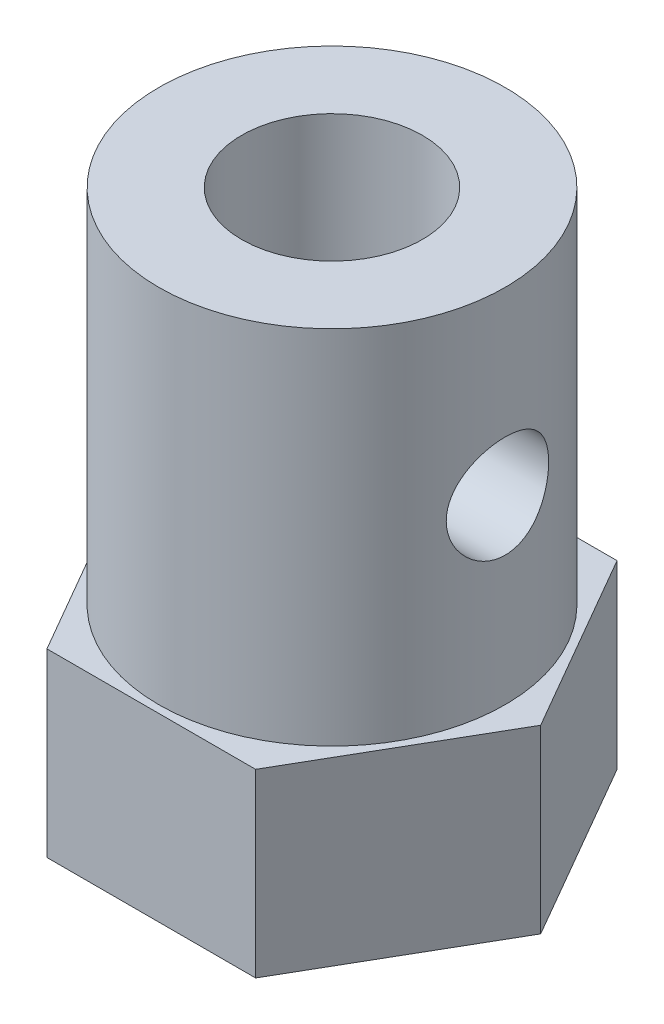
ISO-10303-21;
HEADER;
FILE_DESCRIPTION(('STEP AP214'),'2;1');
FILE_NAME('part.step','',(''),(''),'','','');
FILE_SCHEMA(('AUTOMOTIVE_DESIGN { 1 0 10303 214 1 1 1 1 }'));
ENDSEC;
DATA;
#1=APPLICATION_CONTEXT('core data for automotive mechanical design processes');
#2=APPLICATION_PROTOCOL_DEFINITION('international standard','automotive_design',2000,#1);
#3=PRODUCT_CONTEXT('',#1,'mechanical');
#4=PRODUCT('Part','Part','',(#3));
#5=PRODUCT_RELATED_PRODUCT_CATEGORY('part','',(#4));
#6=PRODUCT_DEFINITION_FORMATION('','',#4);
#7=PRODUCT_DEFINITION_CONTEXT('part definition',#1,'design');
#8=PRODUCT_DEFINITION('design','',#6,#7);
#9=PRODUCT_DEFINITION_SHAPE('','',#8);
#10=(LENGTH_UNIT() NAMED_UNIT(*) SI_UNIT(.MILLI.,.METRE.));
#11=(NAMED_UNIT(*) PLANE_ANGLE_UNIT() SI_UNIT($,.RADIAN.));
#12=(NAMED_UNIT(*) SI_UNIT($,.STERADIAN.) SOLID_ANGLE_UNIT());
#13=UNCERTAINTY_MEASURE_WITH_UNIT(LENGTH_MEASURE(1.E-05),#10,'distance_accuracy_value','');
#14=(GEOMETRIC_REPRESENTATION_CONTEXT(3) GLOBAL_UNCERTAINTY_ASSIGNED_CONTEXT((#13)) GLOBAL_UNIT_ASSIGNED_CONTEXT((#10,
#11,#12)) REPRESENTATION_CONTEXT('',''));
#15=CARTESIAN_POINT('',(0.,0.,0.));
#16=DIRECTION('',(0.,0.,1.));
#17=DIRECTION('',(1.,0.,0.));
#18=AXIS2_PLACEMENT_3D('',#15,#16,#17);
#19=CARTESIAN_POINT('',(0.,17.9,0.));
#20=DIRECTION('',(0.,1.,0.));
#21=DIRECTION('',(0.,0.,1.));
#22=AXIS2_PLACEMENT_3D('',#19,#20,#21);
#23=CYLINDRICAL_SURFACE('',#22,3.);
#24=CARTESIAN_POINT('',(0.,30.,0.));
#25=DIRECTION('',(0.,1.,0.));
#26=DIRECTION('',(0.,0.,1.));
#27=AXIS2_PLACEMENT_3D('',#24,#25,#26);
#28=CIRCLE('',#27,3.);
#29=CARTESIAN_POINT('',(0.,30.,3.));
#30=VERTEX_POINT('',#29);
#31=EDGE_CURVE('E29',#30,#30,#28,.T.);
#32=ORIENTED_EDGE('',*,*,#31,.T.);
#33=EDGE_LOOP('',(#32));
#34=FACE_BOUND('',#33,.T.);
#35=CARTESIAN_POINT('',(2.471841418862,24.,1.7));
#36=CARTESIAN_POINT('',(2.471841418862,23.919608490654,1.7));
#37=CARTESIAN_POINT('',(2.474978398703,23.839267003671,1.695437922941));
#38=CARTESIAN_POINT('',(2.48124747347,23.759261129618,1.686324882331));
#39=CARTESIAN_POINT('',(2.490532243024,23.679891720581,1.672686978551));
#40=CARTESIAN_POINT('',(2.502615676114,23.601474893208,1.65457926602));
#41=CARTESIAN_POINT('',(2.531804023818,23.447009603252,1.60956201305));
#42=CARTESIAN_POINT('',(2.548922440651,23.370967114066,1.582629838758));
#43=CARTESIAN_POINT('',(2.568270797173,23.296382331673,1.551353666844));
#44=CARTESIAN_POINT('',(2.589526398713,23.223448685663,1.51576549763));
#45=CARTESIAN_POINT('',(2.612330276443,23.152387090927,1.475890452406));
#46=CARTESIAN_POINT('',(2.658645811048,23.01916875947,1.390609610484));
#47=CARTESIAN_POINT('',(2.682014228997,22.956709215658,1.345743805274));
#48=CARTESIAN_POINT('',(2.706118165348,22.896204258501,1.297132788015));
#49=CARTESIAN_POINT('',(2.730655303134,22.837834024376,1.244733956587));
#50=CARTESIAN_POINT('',(2.755303342166,22.781825582429,1.188493502947));
#51=CARTESIAN_POINT('',(2.803329771086,22.676835299568,1.070179215338));
#52=CARTESIAN_POINT('',(2.826738539309,22.627649804761,1.008319529317));
#53=CARTESIAN_POINT('',(2.84961345263,22.581192933275,0.94274661728));
#54=CARTESIAN_POINT('',(2.8715985497,22.537801639549,0.873455511936));
#55=CARTESIAN_POINT('',(2.892316025067,22.49785834377,0.800465404399));
#56=CARTESIAN_POINT('',(2.937844330259,22.411686685689,0.617341309515));
#57=CARTESIAN_POINT('',(2.961301105501,22.368702167627,0.503034186623));
#58=CARTESIAN_POINT('',(2.98021552474,22.334914783939,0.382350255227));
#59=CARTESIAN_POINT('',(2.99335179765,22.311731859621,0.257015556875));
#60=CARTESIAN_POINT('',(3.,22.3,0.128918977196));
#61=CARTESIAN_POINT('',(3.,22.3,-0.12892695359));
#62=CARTESIAN_POINT('',(2.993350970784,22.311733309937,-0.257020625034));
#63=CARTESIAN_POINT('',(2.980215179585,22.334915413848,-0.382347078495));
#64=CARTESIAN_POINT('',(2.961302690449,22.368699455888,-0.503023484269));
#65=CARTESIAN_POINT('',(2.937847171272,22.411681308487,-0.617329882381));
#66=CARTESIAN_POINT('',(2.892563465242,22.497390012474,-0.799470149734));
#67=CARTESIAN_POINT('',(2.872135984252,22.536765576972,-0.871560642146));
#68=CARTESIAN_POINT('',(2.85046833533,22.579506115633,-0.940048484606));
#69=CARTESIAN_POINT('',(2.82792434797,22.62524278634,-1.004913890203));
#70=CARTESIAN_POINT('',(2.804847259377,22.673649604885,-1.06616030497));
#71=CARTESIAN_POINT('',(2.756846405376,22.778322929075,-1.184967834719));
#72=CARTESIAN_POINT('',(2.731879022408,22.834924967148,-1.24211936294));
#73=CARTESIAN_POINT('',(2.70701305341,22.893957936589,-1.295328599526));
#74=CARTESIAN_POINT('',(2.682583783114,22.95518473303,-1.344651745628));
#75=CARTESIAN_POINT('',(2.658905373722,23.018417836752,-1.390133353198));
#76=CARTESIAN_POINT('',(2.612192484001,23.152788046097,-1.476142384813));
#77=CARTESIAN_POINT('',(2.589286177906,23.224201898225,-1.516184442826));
#78=CARTESIAN_POINT('',(2.567945061972,23.297504665992,-1.5518983557));
#79=CARTESIAN_POINT('',(2.548533286834,23.37247202526,-1.583258452396));
#80=CARTESIAN_POINT('',(2.531377894732,23.448907625947,-1.610232149477));
#81=CARTESIAN_POINT('',(2.502316464185,23.603421663627,-1.655027596624));
#82=CARTESIAN_POINT('',(2.49034834024,23.681467662664,-1.672957070266));
#83=CARTESIAN_POINT('',(2.481154310846,23.760452679925,-1.686460302154));
#84=CARTESIAN_POINT('',(2.474947296744,23.840065074492,-1.695483168499));
#85=CARTESIAN_POINT('',(2.471841418862,23.920008118195,-1.7));
#86=CARTESIAN_POINT('',(2.471841418862,24.080391509346,-1.7));
#87=CARTESIAN_POINT('',(2.474978398703,24.160732996329,-1.695437922941));
#88=CARTESIAN_POINT('',(2.48124747347,24.240738870382,-1.686324882331));
#89=CARTESIAN_POINT('',(2.490532243024,24.320108279419,-1.672686978551));
#90=CARTESIAN_POINT('',(2.502615676114,24.398525106792,-1.65457926602));
#91=CARTESIAN_POINT('',(2.531804023818,24.552990396748,-1.60956201305));
#92=CARTESIAN_POINT('',(2.548922440651,24.629032885934,-1.582629838758));
#93=CARTESIAN_POINT('',(2.568270797173,24.703617668327,-1.551353666844));
#94=CARTESIAN_POINT('',(2.589526398713,24.776551314337,-1.51576549763));
#95=CARTESIAN_POINT('',(2.612330276443,24.847612909073,-1.475890452406));
#96=CARTESIAN_POINT('',(2.667307520997,25.005745096256,-1.374660794968));
#97=CARTESIAN_POINT('',(2.700281320251,25.091431773809,-1.310407545529));
#98=CARTESIAN_POINT('',(2.734454658158,25.173246646149,-1.23893223428));
#99=CARTESIAN_POINT('',(2.769011213869,25.25068233369,-1.160084840717));
#100=CARTESIAN_POINT('',(2.80304886165,25.323036475565,-1.073694796416));
#101=CARTESIAN_POINT('',(2.860601527271,25.440495855795,-0.907108931722));
#102=CARTESIAN_POINT('',(2.884788884891,25.488143402192,-0.829886817859));
#103=CARTESIAN_POINT('',(2.907559097725,25.53169037906,-0.748088929428));
#104=CARTESIAN_POINT('',(2.928347333545,25.570528821907,-0.66189671824));
#105=CARTESIAN_POINT('',(2.946595411065,25.604042820821,-0.571555310325));
#106=CARTESIAN_POINT('',(2.973920890438,25.653645684876,-0.402020675508));
#107=CARTESIAN_POINT('',(2.984099637851,25.671873011743,-0.324225252002));
#108=CARTESIAN_POINT('',(2.991978929912,25.685846397278,-0.2445377297));
#109=CARTESIAN_POINT('',(2.997322290154,25.695273940768,-0.163537002262));
#110=CARTESIAN_POINT('',(3.,25.7,-0.08182201491294));
#111=CARTESIAN_POINT('',(3.,25.7,0.12892695359));
#112=CARTESIAN_POINT('',(2.993350970784,25.688266690063,0.257020625035));
#113=CARTESIAN_POINT('',(2.980215179585,25.665084586152,0.382347078494));
#114=CARTESIAN_POINT('',(2.961302690449,25.631300544112,0.503023484269));
#115=CARTESIAN_POINT('',(2.937847171272,25.588318691513,0.61732988238));
#116=CARTESIAN_POINT('',(2.892563465238,25.502609987517,0.799470149752));
#117=CARTESIAN_POINT('',(2.872135984252,25.463234423029,0.87156064214));
#118=CARTESIAN_POINT('',(2.850468335335,25.420493884377,0.94004848459));
#119=CARTESIAN_POINT('',(2.827924347971,25.374757213664,1.004913890201));
#120=CARTESIAN_POINT('',(2.804847259371,25.326350395102,1.066160304984));
#121=CARTESIAN_POINT('',(2.756846405376,25.221677070925,1.184967834719));
#122=CARTESIAN_POINT('',(2.731879022408,25.165075032852,1.24211936294));
#123=CARTESIAN_POINT('',(2.70701305341,25.106042063411,1.295328599526));
#124=CARTESIAN_POINT('',(2.682583783114,25.04481526697,1.344651745628));
#125=CARTESIAN_POINT('',(2.658905373722,24.981582163248,1.390133353198));
#126=CARTESIAN_POINT('',(2.612192484001,24.847211953903,1.476142384813));
#127=CARTESIAN_POINT('',(2.589286177906,24.775798101775,1.516184442826));
#128=CARTESIAN_POINT('',(2.567945061972,24.702495334008,1.5518983557));
#129=CARTESIAN_POINT('',(2.548533286834,24.62752797474,1.583258452396));
#130=CARTESIAN_POINT('',(2.531377894732,24.551092374053,1.610232149477));
#131=CARTESIAN_POINT('',(2.502316464185,24.396578336373,1.655027596624));
#132=CARTESIAN_POINT('',(2.49034834024,24.318532337336,1.672957070266));
#133=CARTESIAN_POINT('',(2.481154310846,24.239547320075,1.686460302154));
#134=CARTESIAN_POINT('',(2.474947296744,24.159934925508,1.695483168499));
#135=CARTESIAN_POINT('',(2.471841418862,24.079991881805,1.7));
#136=CARTESIAN_POINT('',(2.471841418862,24.,1.7));
#137=B_SPLINE_CURVE_WITH_KNOTS('',6,(#35,#36,#37,#38,#39,#40,#41,#42,#43,#44,#45,#46,#47,#48,
#49,#50,#51,#52,#53,#54,#55,#56,#57,#58,#59,#60,#61,#62,#63,#64,#65,#66,#67,#68,#69,#70,#71,#72,
#73,#74,#75,#76,#77,#78,#79,#80,#81,#82,#83,#84,#85,#86,#87,#88,#89,#90,#91,#92,#93,#94,#95,#96,
#97,#98,#99,#100,#101,#102,#103,#104,#105,#106,#107,#108,#109,#110,#111,#112,#113,#114,#115,
#116,#117,#118,#119,#120,#121,#122,#123,#124,#125,#126,#127,#128,#129,#130,#131,#132,#133,#134,
#135,#136),.UNSPECIFIED.,.T.,.F.,(7,5,5,5,5,5,5,5,5,5,5,5,5,5,5,5,5,5,5,5,7),(0.,
0.04899157983823,0.09810991635111,0.143907845712,0.188203069379,0.249746289263,0.311293316911,
0.35501133644,0.40139027906,0.450741024641,0.499486628116,0.548475757374,0.597591636966,
0.661137174051,0.710133708572,0.749337978766,0.811112149558,0.854991513176,0.9015416202,
0.95107449781,1.),.UNSPECIFIED.);
#138=CARTESIAN_POINT('',(2.471841418862,24.,1.7));
#139=VERTEX_POINT('',#138);
#140=EDGE_CURVE('E11',#139,#139,#137,.T.);
#141=ORIENTED_EDGE('',*,*,#140,.T.);
#142=EDGE_LOOP('',(#141));
#143=FACE_BOUND('',#142,.T.);
#144=CARTESIAN_POINT('',(0.,17.9,0.));
#145=DIRECTION('',(0.,1.,0.));
#146=DIRECTION('',(0.,0.,1.));
#147=AXIS2_PLACEMENT_3D('',#144,#145,#146);
#148=CIRCLE('',#147,3.);
#149=CARTESIAN_POINT('',(0.,17.9,3.));
#150=VERTEX_POINT('',#149);
#151=EDGE_CURVE('E123',#150,#150,#148,.T.);
#152=ORIENTED_EDGE('',*,*,#151,.F.);
#153=EDGE_LOOP('',(#152));
#154=FACE_BOUND('',#153,.T.);
#155=ADVANCED_FACE('F17',(#34,#143,#154),#23,.F.);
#156=CARTESIAN_POINT('',(0.,24.,0.));
#157=DIRECTION('',(1.,0.,0.));
#158=DIRECTION('',(0.,0.,1.));
#159=AXIS2_PLACEMENT_3D('',#156,#157,#158);
#160=CYLINDRICAL_SURFACE('',#159,1.7);
#161=CARTESIAN_POINT('',(5.49295002708,24.,1.7));
#162=CARTESIAN_POINT('',(5.49295002708,23.820677389687,1.7));
#163=CARTESIAN_POINT('',(5.49964018513,23.641698034388,1.678382827136));
#164=CARTESIAN_POINT('',(5.512977509474,23.464769240056,1.635289055267));
#165=CARTESIAN_POINT('',(5.532510325225,23.291721164574,1.570487487231));
#166=CARTESIAN_POINT('',(5.557359670086,23.12468729057,1.483502577131));
#167=CARTESIAN_POINT('',(5.586135625624,22.966295695157,1.373717082144));
#168=CARTESIAN_POINT('',(5.616860356463,22.819931075266,1.240526366785));
#169=CARTESIAN_POINT('',(5.673280088304,22.576700906581,0.94651159949));
#170=CARTESIAN_POINT('',(5.700139235383,22.471527868633,0.785984896545));
#171=CARTESIAN_POINT('',(5.724776668052,22.383666740285,0.604584574656));
#172=CARTESIAN_POINT('',(5.743968804482,22.319666048249,0.40681394261));
#173=CARTESIAN_POINT('',(5.754983435051,22.283747098328,0.198592335073));
#174=CARTESIAN_POINT('',(5.756589689183,22.277940078683,-0.01349457266515));
#175=CARTESIAN_POINT('',(5.749187308175,22.302037663257,-0.222696117771));
#176=CARTESIAN_POINT('',(5.719371879034,22.405873193373,-0.627108806778));
#177=CARTESIAN_POINT('',(5.697144567532,22.485032481845,-0.815107620397));
#178=CARTESIAN_POINT('',(5.670164282104,22.585652726599,-0.984694595245));
#179=CARTESIAN_POINT('',(5.640954333525,22.703354885494,-1.134828965433));
#180=CARTESIAN_POINT('',(5.611774374419,22.834362511931,-1.26509685353));
#181=CARTESIAN_POINT('',(5.584460148942,22.975370509275,-1.375500389501));
#182=CARTESIAN_POINT('',(5.560383428136,23.123483832713,-1.466354883656));
#183=CARTESIAN_POINT('',(5.518108576302,23.447071915179,-1.61862387709));
#184=CARTESIAN_POINT('',(5.500568349096,23.626659625584,-1.676627027173));
#185=CARTESIAN_POINT('',(5.489355960226,23.811927033674,-1.71162514975));
#186=CARTESIAN_POINT('',(5.485498668477,23.999999999999,-1.723321047219));
#187=CARTESIAN_POINT('',(5.489355960226,24.188072966325,-1.71162514975));
#188=CARTESIAN_POINT('',(5.500568349096,24.373340374417,-1.676627027173));
#189=CARTESIAN_POINT('',(5.518108576302,24.552928084823,-1.618623877089));
#190=CARTESIAN_POINT('',(5.559132681836,24.866942470886,-1.470859923221));
#191=CARTESIAN_POINT('',(5.581420254377,25.00575422748,-1.386952314173));
#192=CARTESIAN_POINT('',(5.606558486917,25.138362210243,-1.286076963682));
#193=CARTESIAN_POINT('',(5.633468329375,25.262554757468,-1.167929817644));
#194=CARTESIAN_POINT('',(5.660727308281,25.375761711279,-1.032386851722));
#195=CARTESIAN_POINT('',(5.686575042858,25.474995779304,-0.879596345778));
#196=CARTESIAN_POINT('',(5.708996611072,25.556746839225,-0.710141443116));
#197=CARTESIAN_POINT('',(5.742208024711,25.67436647747,-0.348145418842));
#198=CARTESIAN_POINT('',(5.753220041338,25.711209442292,-0.159245858548));
#199=CARTESIAN_POINT('',(5.757123348287,25.723465371583,0.03620974739795));
#200=CARTESIAN_POINT('',(5.752885065935,25.709571416194,0.232331920845));
#201=CARTESIAN_POINT('',(5.740791748423,25.670088136944,0.423077282381));
#202=CARTESIAN_POINT('',(5.72252787324,25.607637074687,0.602727391198));
#203=CARTESIAN_POINT('',(5.700561637162,25.527012325138,0.766480614909));
#204=CARTESIAN_POINT('',(5.645115000185,25.307699604657,1.112062164871));
#205=CARTESIAN_POINT('',(5.609317553171,25.153961878628,1.283100598783));
#206=CARTESIAN_POINT('',(5.57422119201,24.98188150501,1.423809107193));
#207=CARTESIAN_POINT('',(5.543174300922,24.796973694148,1.534983418739));
#208=CARTESIAN_POINT('',(5.518456404155,24.603411806535,1.617582133578));
#209=CARTESIAN_POINT('',(5.501480721256,24.404399778336,1.672436691541));
#210=CARTESIAN_POINT('',(5.49295002708,24.2024856401,1.7));
#211=CARTESIAN_POINT('',(5.49295002708,24.,1.7));
#212=B_SPLINE_CURVE_WITH_KNOTS('',8,(#161,#162,#163,#164,#165,#166,#167,#168,#169,#170,#171,
#172,#173,#174,#175,#176,#177,#178,#179,#180,#181,#182,#183,#184,#185,#186,#187,#188,#189,#190,
#191,#192,#193,#194,#195,#196,#197,#198,#199,#200,#201,#202,#203,#204,#205,#206,#207,#208,#209,
#210,#211),.UNSPECIFIED.,.T.,.F.,(9,7,7,7,7,7,7,9),(0.,0.153362473946,0.287375572485,
0.424241592504,0.577426100561,0.705710668275,0.82869963591,1.),.UNSPECIFIED.);
#213=CARTESIAN_POINT('',(5.49295002708,24.,1.7));
#214=VERTEX_POINT('',#213);
#215=EDGE_CURVE('E20',#214,#214,#212,.T.);
#216=ORIENTED_EDGE('',*,*,#215,.T.);
#217=EDGE_LOOP('',(#216));
#218=FACE_BOUND('',#217,.T.);
#219=ORIENTED_EDGE('',*,*,#140,.F.);
#220=EDGE_LOOP('',(#219));
#221=FACE_BOUND('',#220,.T.);
#222=ADVANCED_FACE('F227',(#218,#221),#160,.F.);
#223=CARTESIAN_POINT('',(0.,30.,0.));
#224=DIRECTION('',(0.,1.,0.));
#225=DIRECTION('',(1.,0.,0.));
#226=AXIS2_PLACEMENT_3D('',#223,#224,#225);
#227=PLANE('',#226);
#228=ORIENTED_EDGE('',*,*,#31,.F.);
#229=EDGE_LOOP('',(#228));
#230=FACE_BOUND('',#229,.T.);
#231=CARTESIAN_POINT('',(0.,30.,0.));
#232=DIRECTION('',(0.,1.,0.));
#233=DIRECTION('',(0.,0.,1.));
#234=AXIS2_PLACEMENT_3D('',#231,#232,#233);
#235=CIRCLE('',#234,5.75);
#236=CARTESIAN_POINT('',(0.,30.,5.75));
#237=VERTEX_POINT('',#236);
#238=EDGE_CURVE('E120',#237,#237,#235,.T.);
#239=ORIENTED_EDGE('',*,*,#238,.T.);
#240=EDGE_LOOP('',(#239));
#241=FACE_BOUND('',#240,.T.);
#242=ADVANCED_FACE('F235',(#230,#241),#227,.T.);
#243=CARTESIAN_POINT('',(0.,17.9,0.));
#244=DIRECTION('',(0.,1.,0.));
#245=DIRECTION('',(1.,0.,0.));
#246=AXIS2_PLACEMENT_3D('',#243,#244,#245);
#247=PLANE('',#246);
#248=CARTESIAN_POINT('',(0.,17.9,0.));
#249=DIRECTION('',(0.,1.,0.));
#250=DIRECTION('',(0.,0.,1.));
#251=AXIS2_PLACEMENT_3D('',#248,#249,#250);
#252=CIRCLE('',#251,1.7);
#253=CARTESIAN_POINT('',(0.,17.9,1.7));
#254=VERTEX_POINT('',#253);
#255=EDGE_CURVE('E116',#254,#254,#252,.T.);
#256=ORIENTED_EDGE('',*,*,#255,.F.);
#257=EDGE_LOOP('',(#256));
#258=FACE_BOUND('',#257,.T.);
#259=ORIENTED_EDGE('',*,*,#151,.T.);
#260=EDGE_LOOP('',(#259));
#261=FACE_BOUND('',#260,.T.);
#262=ADVANCED_FACE('F243',(#258,#261),#247,.T.);
#263=CARTESIAN_POINT('',(0.,18.,0.));
#264=DIRECTION('',(0.,1.,0.));
#265=DIRECTION('',(0.,0.,1.));
#266=AXIS2_PLACEMENT_3D('',#263,#264,#265);
#267=CYLINDRICAL_SURFACE('',#266,5.75);
#268=ORIENTED_EDGE('',*,*,#238,.F.);
#269=EDGE_LOOP('',(#268));
#270=FACE_BOUND('',#269,.T.);
#271=ORIENTED_EDGE('',*,*,#215,.F.);
#272=EDGE_LOOP('',(#271));
#273=FACE_BOUND('',#272,.T.);
#274=CARTESIAN_POINT('',(0.,18.,0.));
#275=DIRECTION('',(0.,1.,0.));
#276=DIRECTION('',(0.,0.,1.));
#277=AXIS2_PLACEMENT_3D('',#274,#275,#276);
#278=CIRCLE('',#277,5.75);
#279=CARTESIAN_POINT('',(0.,18.,5.75));
#280=VERTEX_POINT('',#279);
#281=EDGE_CURVE('E104',#280,#280,#278,.T.);
#282=ORIENTED_EDGE('',*,*,#281,.T.);
#283=EDGE_LOOP('',(#282));
#284=FACE_BOUND('',#283,.T.);
#285=ADVANCED_FACE('F262',(#270,#273,#284),#267,.T.);
#286=CARTESIAN_POINT('',(0.,11.9,0.));
#287=DIRECTION('',(0.,1.,0.));
#288=DIRECTION('',(0.,0.,1.));
#289=AXIS2_PLACEMENT_3D('',#286,#287,#288);
#290=CYLINDRICAL_SURFACE('',#289,1.7);
#291=ORIENTED_EDGE('',*,*,#255,.T.);
#292=EDGE_LOOP('',(#291));
#293=FACE_BOUND('',#292,.T.);
#294=CARTESIAN_POINT('',(0.,12.,0.));
#295=DIRECTION('',(0.,1.,0.));
#296=DIRECTION('',(0.,0.,1.));
#297=AXIS2_PLACEMENT_3D('',#294,#295,#296);
#298=CIRCLE('',#297,1.7);
#299=CARTESIAN_POINT('',(0.,12.,1.7));
#300=VERTEX_POINT('',#299);
#301=EDGE_CURVE('E156',#300,#300,#298,.T.);
#302=ORIENTED_EDGE('',*,*,#301,.F.);
#303=EDGE_LOOP('',(#302));
#304=FACE_BOUND('',#303,.T.);
#305=ADVANCED_FACE('F253',(#293,#304),#290,.F.);
#306=CARTESIAN_POINT('',(-6.928203230276,12.,0.));
#307=DIRECTION('',(-0.866025403784329,0.,-0.50000000000019));
#308=DIRECTION('',(-0.50000000000019,0.,0.866025403784329));
#309=AXIS2_PLACEMENT_3D('',#306,#307,#308);
#310=PLANE('',#309);
#311=DIRECTION('',(0.,1.,0.));
#312=VECTOR('',#311,1.);
#313=CARTESIAN_POINT('',(-6.928203230276,12.,0.));
#314=LINE('',#313,#312);
#315=CARTESIAN_POINT('',(-6.928203230276,12.,0.));
#316=VERTEX_POINT('',#315);
#317=CARTESIAN_POINT('',(-6.928203230276,18.,0.));
#318=VERTEX_POINT('',#317);
#319=EDGE_CURVE('E42',#316,#318,#314,.T.);
#320=ORIENTED_EDGE('',*,*,#319,.T.);
#321=DIRECTION('',(0.50000000000019,0.,-0.866025403784329));
#322=VECTOR('',#321,1.);
#323=CARTESIAN_POINT('',(-6.928203230276,18.,0.));
#324=LINE('',#323,#322);
#325=CARTESIAN_POINT('',(-3.464101615138,18.,-6.));
#326=VERTEX_POINT('',#325);
#327=EDGE_CURVE('E111',#318,#326,#324,.T.);
#328=ORIENTED_EDGE('',*,*,#327,.T.);
#329=DIRECTION('',(0.,1.,0.));
#330=VECTOR('',#329,1.);
#331=CARTESIAN_POINT('',(-3.464101615138,12.,-6.));
#332=LINE('',#331,#330);
#333=CARTESIAN_POINT('',(-3.464101615138,12.,-6.));
#334=VERTEX_POINT('',#333);
#335=EDGE_CURVE('E106',#334,#326,#332,.T.);
#336=ORIENTED_EDGE('',*,*,#335,.F.);
#337=DIRECTION('',(0.50000000000019,0.,-0.866025403784329));
#338=VECTOR('',#337,1.);
#339=CARTESIAN_POINT('',(-6.928203230276,12.,0.));
#340=LINE('',#339,#338);
#341=EDGE_CURVE('E77',#316,#334,#340,.T.);
#342=ORIENTED_EDGE('',*,*,#341,.F.);
#343=EDGE_LOOP('',(#320,#328,#336,#342));
#344=FACE_BOUND('',#343,.T.);
#345=ADVANCED_FACE('F196',(#344),#310,.T.);
#346=CARTESIAN_POINT('',(-3.464101615138,12.,6.));
#347=DIRECTION('',(-0.866025403784329,0.,0.50000000000019));
#348=DIRECTION('',(0.,1.,0.));
#349=AXIS2_PLACEMENT_3D('',#346,#347,#348);
#350=PLANE('',#349);
#351=DIRECTION('',(0.,1.,0.));
#352=VECTOR('',#351,1.);
#353=CARTESIAN_POINT('',(-3.464101615138,12.,6.));
#354=LINE('',#353,#352);
#355=CARTESIAN_POINT('',(-3.464101615138,12.,6.));
#356=VERTEX_POINT('',#355);
#357=CARTESIAN_POINT('',(-3.464101615138,18.,6.));
#358=VERTEX_POINT('',#357);
#359=EDGE_CURVE('E72',#356,#358,#354,.T.);
#360=ORIENTED_EDGE('',*,*,#359,.T.);
#361=DIRECTION('',(-0.50000000000019,0.,-0.866025403784329));
#362=VECTOR('',#361,1.);
#363=CARTESIAN_POINT('',(-3.464101615138,18.,6.));
#364=LINE('',#363,#362);
#365=EDGE_CURVE('E107',#358,#318,#364,.T.);
#366=ORIENTED_EDGE('',*,*,#365,.T.);
#367=ORIENTED_EDGE('',*,*,#319,.F.);
#368=DIRECTION('',(-0.50000000000019,0.,-0.866025403784329));
#369=VECTOR('',#368,1.);
#370=CARTESIAN_POINT('',(-3.464101615138,12.,6.));
#371=LINE('',#370,#369);
#372=EDGE_CURVE('E68',#356,#316,#371,.T.);
#373=ORIENTED_EDGE('',*,*,#372,.F.);
#374=EDGE_LOOP('',(#360,#366,#367,#373));
#375=FACE_BOUND('',#374,.T.);
#376=ADVANCED_FACE('F70',(#375),#350,.T.);
#377=CARTESIAN_POINT('',(-3.464101615138,12.,-6.));
#378=DIRECTION('',(0.,0.,-1.));
#379=DIRECTION('',(-1.,0.,0.));
#380=AXIS2_PLACEMENT_3D('',#377,#378,#379);
#381=PLANE('',#380);
#382=ORIENTED_EDGE('',*,*,#335,.T.);
#383=DIRECTION('',(1.,0.,0.));
#384=VECTOR('',#383,1.);
#385=CARTESIAN_POINT('',(-3.464101615138,18.,-6.));
#386=LINE('',#385,#384);
#387=CARTESIAN_POINT('',(3.464101615138,18.,-6.));
#388=VERTEX_POINT('',#387);
#389=EDGE_CURVE('E147',#326,#388,#386,.T.);
#390=ORIENTED_EDGE('',*,*,#389,.T.);
#391=DIRECTION('',(0.,1.,0.));
#392=VECTOR('',#391,1.);
#393=CARTESIAN_POINT('',(3.464101615138,12.,-6.));
#394=LINE('',#393,#392);
#395=CARTESIAN_POINT('',(3.464101615138,12.,-6.));
#396=VERTEX_POINT('',#395);
#397=EDGE_CURVE('E144',#396,#388,#394,.T.);
#398=ORIENTED_EDGE('',*,*,#397,.F.);
#399=DIRECTION('',(1.,0.,0.));
#400=VECTOR('',#399,1.);
#401=CARTESIAN_POINT('',(-3.464101615138,12.,-6.));
#402=LINE('',#401,#400);
#403=EDGE_CURVE('E152',#334,#396,#402,.T.);
#404=ORIENTED_EDGE('',*,*,#403,.F.);
#405=EDGE_LOOP('',(#382,#390,#398,#404));
#406=FACE_BOUND('',#405,.T.);
#407=ADVANCED_FACE('F170',(#406),#381,.T.);
#408=CARTESIAN_POINT('',(0.,18.,0.));
#409=DIRECTION('',(0.,-1.,0.));
#410=DIRECTION('',(0.,0.,-1.));
#411=AXIS2_PLACEMENT_3D('',#408,#409,#410);
#412=PLANE('',#411);
#413=ORIENTED_EDGE('',*,*,#281,.F.);
#414=EDGE_LOOP('',(#413));
#415=FACE_BOUND('',#414,.T.);
#416=DIRECTION('',(0.50000000000019,0.,0.866025403784329));
#417=VECTOR('',#416,1.);
#418=CARTESIAN_POINT('',(3.464101615138,18.,-6.));
#419=LINE('',#418,#417);
#420=CARTESIAN_POINT('',(6.928203230276,18.,0.));
#421=VERTEX_POINT('',#420);
#422=EDGE_CURVE('E148',#388,#421,#419,.T.);
#423=ORIENTED_EDGE('',*,*,#422,.F.);
#424=ORIENTED_EDGE('',*,*,#389,.F.);
#425=ORIENTED_EDGE('',*,*,#327,.F.);
#426=ORIENTED_EDGE('',*,*,#365,.F.);
#427=DIRECTION('',(-1.,0.,0.));
#428=VECTOR('',#427,1.);
#429=CARTESIAN_POINT('',(3.464101615138,18.,6.));
#430=LINE('',#429,#428);
#431=CARTESIAN_POINT('',(3.464101615138,18.,6.));
#432=VERTEX_POINT('',#431);
#433=EDGE_CURVE('E94',#432,#358,#430,.T.);
#434=ORIENTED_EDGE('',*,*,#433,.F.);
#435=DIRECTION('',(-0.50000000000019,0.,0.866025403784329));
#436=VECTOR('',#435,1.);
#437=CARTESIAN_POINT('',(6.928203230276,18.,0.));
#438=LINE('',#437,#436);
#439=EDGE_CURVE('E180',#421,#432,#438,.T.);
#440=ORIENTED_EDGE('',*,*,#439,.F.);
#441=EDGE_LOOP('',(#423,#424,#425,#426,#434,#440));
#442=FACE_BOUND('',#441,.T.);
#443=ADVANCED_FACE('F177',(#415,#442),#412,.F.);
#444=CARTESIAN_POINT('',(0.,12.,0.));
#445=DIRECTION('',(0.,-1.,0.));
#446=DIRECTION('',(0.,0.,-1.));
#447=AXIS2_PLACEMENT_3D('',#444,#445,#446);
#448=PLANE('',#447);
#449=ORIENTED_EDGE('',*,*,#301,.T.);
#450=EDGE_LOOP('',(#449));
#451=FACE_BOUND('',#450,.T.);
#452=DIRECTION('',(-0.50000000000019,0.,0.866025403784329));
#453=VECTOR('',#452,1.);
#454=CARTESIAN_POINT('',(6.928203230276,12.,0.));
#455=LINE('',#454,#453);
#456=CARTESIAN_POINT('',(6.928203230276,12.,0.));
#457=VERTEX_POINT('',#456);
#458=CARTESIAN_POINT('',(3.464101615138,12.,6.));
#459=VERTEX_POINT('',#458);
#460=EDGE_CURVE('E86',#457,#459,#455,.T.);
#461=ORIENTED_EDGE('',*,*,#460,.T.);
#462=DIRECTION('',(-1.,0.,0.));
#463=VECTOR('',#462,1.);
#464=CARTESIAN_POINT('',(3.464101615138,12.,6.));
#465=LINE('',#464,#463);
#466=EDGE_CURVE('E78',#459,#356,#465,.T.);
#467=ORIENTED_EDGE('',*,*,#466,.T.);
#468=ORIENTED_EDGE('',*,*,#372,.T.);
#469=ORIENTED_EDGE('',*,*,#341,.T.);
#470=ORIENTED_EDGE('',*,*,#403,.T.);
#471=DIRECTION('',(0.50000000000019,0.,0.866025403784329));
#472=VECTOR('',#471,1.);
#473=CARTESIAN_POINT('',(3.464101615138,12.,-6.));
#474=LINE('',#473,#472);
#475=EDGE_CURVE('E100',#396,#457,#474,.T.);
#476=ORIENTED_EDGE('',*,*,#475,.T.);
#477=EDGE_LOOP('',(#461,#467,#468,#469,#470,#476));
#478=FACE_BOUND('',#477,.T.);
#479=ADVANCED_FACE('F82',(#451,#478),#448,.T.);
#480=CARTESIAN_POINT('',(3.464101615138,12.,6.));
#481=DIRECTION('',(0.,0.,1.));
#482=DIRECTION('',(1.,0.,0.));
#483=AXIS2_PLACEMENT_3D('',#480,#481,#482);
#484=PLANE('',#483);
#485=DIRECTION('',(0.,1.,0.));
#486=VECTOR('',#485,1.);
#487=CARTESIAN_POINT('',(3.464101615138,12.,6.));
#488=LINE('',#487,#486);
#489=EDGE_CURVE('E189',#459,#432,#488,.T.);
#490=ORIENTED_EDGE('',*,*,#489,.T.);
#491=ORIENTED_EDGE('',*,*,#433,.T.);
#492=ORIENTED_EDGE('',*,*,#359,.F.);
#493=ORIENTED_EDGE('',*,*,#466,.F.);
#494=EDGE_LOOP('',(#490,#491,#492,#493));
#495=FACE_BOUND('',#494,.T.);
#496=ADVANCED_FACE('F92',(#495),#484,.T.);
#497=CARTESIAN_POINT('',(3.464101615138,12.,-6.));
#498=DIRECTION('',(0.866025403784329,0.,-0.50000000000019));
#499=DIRECTION('',(0.,-1.,0.));
#500=AXIS2_PLACEMENT_3D('',#497,#498,#499);
#501=PLANE('',#500);
#502=ORIENTED_EDGE('',*,*,#397,.T.);
#503=ORIENTED_EDGE('',*,*,#422,.T.);
#504=DIRECTION('',(0.,1.,0.));
#505=VECTOR('',#504,1.);
#506=CARTESIAN_POINT('',(6.928203230276,12.,0.));
#507=LINE('',#506,#505);
#508=EDGE_CURVE('E202',#457,#421,#507,.T.);
#509=ORIENTED_EDGE('',*,*,#508,.F.);
#510=ORIENTED_EDGE('',*,*,#475,.F.);
#511=EDGE_LOOP('',(#502,#503,#509,#510));
#512=FACE_BOUND('',#511,.T.);
#513=ADVANCED_FACE('F185',(#512),#501,.T.);
#514=CARTESIAN_POINT('',(6.928203230276,12.,0.));
#515=DIRECTION('',(0.866025403784329,0.,0.50000000000019));
#516=DIRECTION('',(0.,-1.,0.));
#517=AXIS2_PLACEMENT_3D('',#514,#515,#516);
#518=PLANE('',#517);
#519=ORIENTED_EDGE('',*,*,#508,.T.);
#520=ORIENTED_EDGE('',*,*,#439,.T.);
#521=ORIENTED_EDGE('',*,*,#489,.F.);
#522=ORIENTED_EDGE('',*,*,#460,.F.);
#523=EDGE_LOOP('',(#519,#520,#521,#522));
#524=FACE_BOUND('',#523,.T.);
#525=ADVANCED_FACE('F201',(#524),#518,.T.);
#526=CLOSED_SHELL('',(#155,#222,#242,#262,#285,#305,#345,#376,#407,#443,#479,#496,#513,#525));
#527=MANIFOLD_SOLID_BREP('B1',#526);
#528=ADVANCED_BREP_SHAPE_REPRESENTATION('',(#18,#527),#14);
#529=SHAPE_DEFINITION_REPRESENTATION(#9,#528);
ENDSEC;
END-ISO-10303-21;
